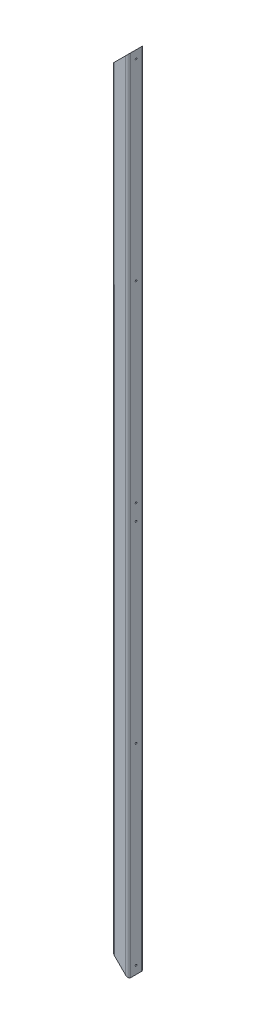
ISO-10303-21;
HEADER;
FILE_DESCRIPTION(('STEP AP214'),'2;1');
FILE_NAME('part.step','',(''),(''),'','','');
FILE_SCHEMA(('AUTOMOTIVE_DESIGN { 1 0 10303 214 1 1 1 1 }'));
ENDSEC;
DATA;
#1=APPLICATION_CONTEXT('core data for automotive mechanical design processes');
#2=APPLICATION_PROTOCOL_DEFINITION('international standard','automotive_design',2000,#1);
#3=PRODUCT_CONTEXT('',#1,'mechanical');
#4=PRODUCT('Part','Part','',(#3));
#5=PRODUCT_RELATED_PRODUCT_CATEGORY('part','',(#4));
#6=PRODUCT_DEFINITION_FORMATION('','',#4);
#7=PRODUCT_DEFINITION_CONTEXT('part definition',#1,'design');
#8=PRODUCT_DEFINITION('design','',#6,#7);
#9=PRODUCT_DEFINITION_SHAPE('','',#8);
#10=(LENGTH_UNIT() NAMED_UNIT(*) SI_UNIT(.MILLI.,.METRE.));
#11=(NAMED_UNIT(*) PLANE_ANGLE_UNIT() SI_UNIT($,.RADIAN.));
#12=(NAMED_UNIT(*) SI_UNIT($,.STERADIAN.) SOLID_ANGLE_UNIT());
#13=UNCERTAINTY_MEASURE_WITH_UNIT(LENGTH_MEASURE(1.E-05),#10,'distance_accuracy_value','');
#14=(GEOMETRIC_REPRESENTATION_CONTEXT(3) GLOBAL_UNCERTAINTY_ASSIGNED_CONTEXT((#13)) GLOBAL_UNIT_ASSIGNED_CONTEXT((#10,
#11,#12)) REPRESENTATION_CONTEXT('',''));
#15=CARTESIAN_POINT('',(0.,0.,0.));
#16=DIRECTION('',(0.,0.,1.));
#17=DIRECTION('',(1.,0.,0.));
#18=AXIS2_PLACEMENT_3D('',#15,#16,#17);
#19=CARTESIAN_POINT('',(-20.,2000.,13.6));
#20=DIRECTION('',(1.,0.,0.));
#21=DIRECTION('',(0.,0.,-1.));
#22=AXIS2_PLACEMENT_3D('',#19,#20,#21);
#23=PLANE('',#22);
#24=DIRECTION('',(0.,0.,-1.));
#25=VECTOR('',#24,1.);
#26=CARTESIAN_POINT('',(-20.,1960.,20.));
#27=LINE('',#26,#25);
#28=CARTESIAN_POINT('',(-20.,1960.,13.6));
#29=VERTEX_POINT('',#28);
#30=CARTESIAN_POINT('',(-20.,1960.,-13.6));
#31=VERTEX_POINT('',#30);
#32=EDGE_CURVE('E354',#29,#31,#27,.T.);
#33=ORIENTED_EDGE('',*,*,#32,.T.);
#34=DIRECTION('',(0.,-1.,0.));
#35=VECTOR('',#34,1.);
#36=CARTESIAN_POINT('',(-20.,2000.,-13.6));
#37=LINE('',#36,#35);
#38=CARTESIAN_POINT('',(-20.,40.,-13.6));
#39=VERTEX_POINT('',#38);
#40=EDGE_CURVE('E218',#31,#39,#37,.T.);
#41=ORIENTED_EDGE('',*,*,#40,.T.);
#42=DIRECTION('',(0.,0.,-1.));
#43=VECTOR('',#42,1.);
#44=CARTESIAN_POINT('',(-20.,40.,20.));
#45=LINE('',#44,#43);
#46=CARTESIAN_POINT('',(-20.,40.,13.6));
#47=VERTEX_POINT('',#46);
#48=EDGE_CURVE('E355',#47,#39,#45,.T.);
#49=ORIENTED_EDGE('',*,*,#48,.F.);
#50=DIRECTION('',(0.,-1.,0.));
#51=VECTOR('',#50,1.);
#52=CARTESIAN_POINT('',(-20.,2000.,13.6));
#53=LINE('',#52,#51);
#54=EDGE_CURVE('E261',#29,#47,#53,.T.);
#55=ORIENTED_EDGE('',*,*,#54,.F.);
#56=EDGE_LOOP('',(#33,#41,#49,#55));
#57=FACE_BOUND('',#56,.T.);
#58=ADVANCED_FACE('F67',(#57),#23,.F.);
#59=CARTESIAN_POINT('',(-13.6,2000.,-13.6));
#60=DIRECTION('',(0.,-1.,0.));
#61=DIRECTION('',(0.,0.,-1.));
#62=AXIS2_PLACEMENT_3D('',#59,#60,#61);
#63=CYLINDRICAL_SURFACE('',#62,6.4);
#64=CARTESIAN_POINT('',(-13.6,1966.4,-13.6));
#65=DIRECTION('',(-0.707106781186548,0.707106781186547,0.));
#66=DIRECTION('',(-0.707106781186547,-0.707106781186548,0.));
#67=AXIS2_PLACEMENT_3D('',#64,#65,#66);
#68=ELLIPSE('',#67,9.05096679918782,6.4);
#69=CARTESIAN_POINT('',(-13.6000000000001,1966.4,-20.));
#70=VERTEX_POINT('',#69);
#71=EDGE_CURVE('E290',#70,#31,#68,.T.);
#72=ORIENTED_EDGE('',*,*,#71,.F.);
#73=DIRECTION('',(0.,-1.,0.));
#74=VECTOR('',#73,1.);
#75=CARTESIAN_POINT('',(-13.6,2000.,-20.));
#76=LINE('',#75,#74);
#77=CARTESIAN_POINT('',(-13.6,33.5999999999999,-20.));
#78=VERTEX_POINT('',#77);
#79=EDGE_CURVE('E212',#70,#78,#76,.T.);
#80=ORIENTED_EDGE('',*,*,#79,.T.);
#81=CARTESIAN_POINT('',(-13.6,33.6000000000001,-13.6));
#82=DIRECTION('',(-0.707106781186547,-0.707106781186548,0.));
#83=DIRECTION('',(0.707106781186548,-0.707106781186547,0.));
#84=AXIS2_PLACEMENT_3D('',#81,#82,#83);
#85=ELLIPSE('',#84,9.05096679918781,6.4);
#86=EDGE_CURVE('E188',#39,#78,#85,.T.);
#87=ORIENTED_EDGE('',*,*,#86,.F.);
#88=ORIENTED_EDGE('',*,*,#40,.F.);
#89=EDGE_LOOP('',(#72,#80,#87,#88));
#90=FACE_BOUND('',#89,.T.);
#91=ADVANCED_FACE('F458',(#90),#63,.T.);
#92=CARTESIAN_POINT('',(13.6,2000.,-20.));
#93=DIRECTION('',(0.,0.,1.));
#94=DIRECTION('',(1.,0.,0.));
#95=AXIS2_PLACEMENT_3D('',#92,#93,#94);
#96=PLANE('',#95);
#97=DIRECTION('',(0.707106781186547,0.707106781186548,0.));
#98=VECTOR('',#97,1.);
#99=CARTESIAN_POINT('',(-990.,990.,-20.));
#100=LINE('',#99,#98);
#101=CARTESIAN_POINT('',(13.6000000000002,1993.6,-20.));
#102=VERTEX_POINT('',#101);
#103=EDGE_CURVE('E210',#70,#102,#100,.T.);
#104=ORIENTED_EDGE('',*,*,#103,.T.);
#105=DIRECTION('',(0.,-1.,0.));
#106=VECTOR('',#105,1.);
#107=CARTESIAN_POINT('',(13.6,2000.,-20.));
#108=LINE('',#107,#106);
#109=CARTESIAN_POINT('',(13.5999999999998,6.40000000000018,-20.));
#110=VERTEX_POINT('',#109);
#111=EDGE_CURVE('E202',#102,#110,#108,.T.);
#112=ORIENTED_EDGE('',*,*,#111,.T.);
#113=DIRECTION('',(-0.707106781186548,0.707106781186547,0.));
#114=VECTOR('',#113,1.);
#115=CARTESIAN_POINT('',(10.,10.,-20.));
#116=LINE('',#115,#114);
#117=EDGE_CURVE('E182',#110,#78,#116,.T.);
#118=ORIENTED_EDGE('',*,*,#117,.T.);
#119=ORIENTED_EDGE('',*,*,#79,.F.);
#120=EDGE_LOOP('',(#104,#112,#118,#119));
#121=FACE_BOUND('',#120,.T.);
#122=ADVANCED_FACE('F209',(#121),#96,.F.);
#123=CARTESIAN_POINT('',(20.,2000.,-13.6));
#124=DIRECTION('',(-1.,0.,0.));
#125=DIRECTION('',(0.,0.,1.));
#126=AXIS2_PLACEMENT_3D('',#123,#124,#125);
#127=PLANE('',#126);
#128=CARTESIAN_POINT('',(20.,1980.,0.));
#129=DIRECTION('',(1.,0.,0.));
#130=DIRECTION('',(0.,0.,-1.));
#131=AXIS2_PLACEMENT_3D('',#128,#129,#130);
#132=CIRCLE('',#131,2.);
#133=CARTESIAN_POINT('',(20.,1980.,-2.00000000000001));
#134=VERTEX_POINT('',#133);
#135=EDGE_CURVE('E394',#134,#134,#132,.T.);
#136=ORIENTED_EDGE('',*,*,#135,.F.);
#137=EDGE_LOOP('',(#136));
#138=FACE_BOUND('',#137,.T.);
#139=CARTESIAN_POINT('',(20.,500.,0.));
#140=DIRECTION('',(1.,0.,0.));
#141=DIRECTION('',(0.,0.,-1.));
#142=AXIS2_PLACEMENT_3D('',#139,#140,#141);
#143=CIRCLE('',#142,2.);
#144=CARTESIAN_POINT('',(20.,500.,-2.00000000000001));
#145=VERTEX_POINT('',#144);
#146=EDGE_CURVE('E376',#145,#145,#143,.T.);
#147=ORIENTED_EDGE('',*,*,#146,.F.);
#148=EDGE_LOOP('',(#147));
#149=FACE_BOUND('',#148,.T.);
#150=CARTESIAN_POINT('',(20.,980.,0.));
#151=DIRECTION('',(1.,0.,0.));
#152=DIRECTION('',(0.,0.,-1.));
#153=AXIS2_PLACEMENT_3D('',#150,#151,#152);
#154=CIRCLE('',#153,2.);
#155=CARTESIAN_POINT('',(20.,980.,-2.00000000000001));
#156=VERTEX_POINT('',#155);
#157=EDGE_CURVE('E402',#156,#156,#154,.T.);
#158=ORIENTED_EDGE('',*,*,#157,.F.);
#159=EDGE_LOOP('',(#158));
#160=FACE_BOUND('',#159,.T.);
#161=CARTESIAN_POINT('',(20.,1020.,0.));
#162=DIRECTION('',(1.,0.,0.));
#163=DIRECTION('',(0.,0.,-1.));
#164=AXIS2_PLACEMENT_3D('',#161,#162,#163);
#165=CIRCLE('',#164,2.);
#166=CARTESIAN_POINT('',(20.,1020.,-2.00000000000001));
#167=VERTEX_POINT('',#166);
#168=EDGE_CURVE('E377',#167,#167,#165,.T.);
#169=ORIENTED_EDGE('',*,*,#168,.F.);
#170=EDGE_LOOP('',(#169));
#171=FACE_BOUND('',#170,.T.);
#172=CARTESIAN_POINT('',(20.,20.,0.));
#173=DIRECTION('',(1.,0.,0.));
#174=DIRECTION('',(0.,0.,-1.));
#175=AXIS2_PLACEMENT_3D('',#172,#173,#174);
#176=CIRCLE('',#175,2.);
#177=CARTESIAN_POINT('',(20.,20.,-2.00000000000001));
#178=VERTEX_POINT('',#177);
#179=EDGE_CURVE('E386',#178,#178,#176,.T.);
#180=ORIENTED_EDGE('',*,*,#179,.F.);
#181=EDGE_LOOP('',(#180));
#182=FACE_BOUND('',#181,.T.);
#183=CARTESIAN_POINT('',(20.,1500.,0.));
#184=DIRECTION('',(1.,0.,0.));
#185=DIRECTION('',(0.,0.,-1.));
#186=AXIS2_PLACEMENT_3D('',#183,#184,#185);
#187=CIRCLE('',#186,2.);
#188=CARTESIAN_POINT('',(20.,1500.,-2.00000000000001));
#189=VERTEX_POINT('',#188);
#190=EDGE_CURVE('E368',#189,#189,#187,.T.);
#191=ORIENTED_EDGE('',*,*,#190,.F.);
#192=EDGE_LOOP('',(#191));
#193=FACE_BOUND('',#192,.T.);
#194=DIRECTION('',(0.,0.,-1.));
#195=VECTOR('',#194,1.);
#196=CARTESIAN_POINT('',(20.,0.,-13.6));
#197=LINE('',#196,#195);
#198=CARTESIAN_POINT('',(20.,0.,13.6));
#199=VERTEX_POINT('',#198);
#200=CARTESIAN_POINT('',(20.,0.,-13.6));
#201=VERTEX_POINT('',#200);
#202=EDGE_CURVE('E276',#199,#201,#197,.T.);
#203=ORIENTED_EDGE('',*,*,#202,.T.);
#204=DIRECTION('',(0.,-1.,0.));
#205=VECTOR('',#204,1.);
#206=CARTESIAN_POINT('',(20.,2000.,-13.6));
#207=LINE('',#206,#205);
#208=CARTESIAN_POINT('',(20.,2000.,-13.6));
#209=VERTEX_POINT('',#208);
#210=EDGE_CURVE('E204',#209,#201,#207,.T.);
#211=ORIENTED_EDGE('',*,*,#210,.F.);
#212=DIRECTION('',(0.,0.,-1.));
#213=VECTOR('',#212,1.);
#214=CARTESIAN_POINT('',(20.,2000.,-13.6));
#215=LINE('',#214,#213);
#216=CARTESIAN_POINT('',(20.,2000.,13.6));
#217=VERTEX_POINT('',#216);
#218=EDGE_CURVE('E233',#217,#209,#215,.T.);
#219=ORIENTED_EDGE('',*,*,#218,.F.);
#220=DIRECTION('',(0.,-1.,0.));
#221=VECTOR('',#220,1.);
#222=CARTESIAN_POINT('',(20.,2000.,13.6));
#223=LINE('',#222,#221);
#224=EDGE_CURVE('E216',#217,#199,#223,.T.);
#225=ORIENTED_EDGE('',*,*,#224,.T.);
#226=EDGE_LOOP('',(#203,#211,#219,#225));
#227=FACE_BOUND('',#226,.T.);
#228=ADVANCED_FACE('F425',(#138,#149,#160,#171,#182,#193,#227),#127,.F.);
#229=CARTESIAN_POINT('',(13.6,2000.,-13.6));
#230=DIRECTION('',(0.,-1.,0.));
#231=DIRECTION('',(0.,0.,-1.));
#232=AXIS2_PLACEMENT_3D('',#229,#230,#231);
#233=CYLINDRICAL_SURFACE('',#232,6.4);
#234=CARTESIAN_POINT('',(13.6,1993.6,-13.6));
#235=DIRECTION('',(-0.707106781186548,0.707106781186547,0.));
#236=DIRECTION('',(-0.707106781186547,-0.707106781186548,0.));
#237=AXIS2_PLACEMENT_3D('',#234,#235,#236);
#238=ELLIPSE('',#237,9.05096679918781,6.4);
#239=EDGE_CURVE('E287',#209,#102,#238,.T.);
#240=ORIENTED_EDGE('',*,*,#239,.F.);
#241=ORIENTED_EDGE('',*,*,#210,.T.);
#242=CARTESIAN_POINT('',(13.6,6.40000000000018,-13.6));
#243=DIRECTION('',(-0.707106781186547,-0.707106781186548,0.));
#244=DIRECTION('',(0.707106781186548,-0.707106781186547,0.));
#245=AXIS2_PLACEMENT_3D('',#242,#243,#244);
#246=ELLIPSE('',#245,9.05096679918781,6.4);
#247=EDGE_CURVE('E185',#110,#201,#246,.T.);
#248=ORIENTED_EDGE('',*,*,#247,.F.);
#249=ORIENTED_EDGE('',*,*,#111,.F.);
#250=EDGE_LOOP('',(#240,#241,#248,#249));
#251=FACE_BOUND('',#250,.T.);
#252=ADVANCED_FACE('F201',(#251),#233,.T.);
#253=CARTESIAN_POINT('',(13.6,2000.,13.6));
#254=DIRECTION('',(0.,-1.,0.));
#255=DIRECTION('',(0.,0.,-1.));
#256=AXIS2_PLACEMENT_3D('',#253,#254,#255);
#257=CYLINDRICAL_SURFACE('',#256,6.4);
#258=CARTESIAN_POINT('',(13.6,1993.6,13.6));
#259=DIRECTION('',(-0.707106781186548,0.707106781186547,0.));
#260=DIRECTION('',(-0.707106781186547,-0.707106781186548,0.));
#261=AXIS2_PLACEMENT_3D('',#258,#259,#260);
#262=ELLIPSE('',#261,9.05096679918782,6.4);
#263=CARTESIAN_POINT('',(13.6,1993.6,20.));
#264=VERTEX_POINT('',#263);
#265=EDGE_CURVE('E284',#264,#217,#262,.T.);
#266=ORIENTED_EDGE('',*,*,#265,.F.);
#267=DIRECTION('',(0.,-1.,0.));
#268=VECTOR('',#267,1.);
#269=CARTESIAN_POINT('',(13.6,2000.,20.));
#270=LINE('',#269,#268);
#271=CARTESIAN_POINT('',(13.5999999999999,6.40000000000016,20.));
#272=VERTEX_POINT('',#271);
#273=EDGE_CURVE('E77',#264,#272,#270,.T.);
#274=ORIENTED_EDGE('',*,*,#273,.T.);
#275=CARTESIAN_POINT('',(13.6,6.40000000000018,13.6));
#276=DIRECTION('',(-0.707106781186547,-0.707106781186548,0.));
#277=DIRECTION('',(0.707106781186548,-0.707106781186547,0.));
#278=AXIS2_PLACEMENT_3D('',#275,#276,#277);
#279=ELLIPSE('',#278,9.05096679918781,6.4);
#280=EDGE_CURVE('E206',#199,#272,#279,.T.);
#281=ORIENTED_EDGE('',*,*,#280,.F.);
#282=ORIENTED_EDGE('',*,*,#224,.F.);
#283=EDGE_LOOP('',(#266,#274,#281,#282));
#284=FACE_BOUND('',#283,.T.);
#285=ADVANCED_FACE('F445',(#284),#257,.T.);
#286=CARTESIAN_POINT('',(-13.6,2000.,20.));
#287=DIRECTION('',(0.,0.,-1.));
#288=DIRECTION('',(-1.,0.,0.));
#289=AXIS2_PLACEMENT_3D('',#286,#287,#288);
#290=PLANE('',#289);
#291=DIRECTION('',(0.707106781186547,0.707106781186548,0.));
#292=VECTOR('',#291,1.);
#293=CARTESIAN_POINT('',(-990.,990.,20.));
#294=LINE('',#293,#292);
#295=CARTESIAN_POINT('',(-13.5999999999999,1966.4,20.));
#296=VERTEX_POINT('',#295);
#297=EDGE_CURVE('E363',#296,#264,#294,.T.);
#298=ORIENTED_EDGE('',*,*,#297,.F.);
#299=DIRECTION('',(0.,-1.,0.));
#300=VECTOR('',#299,1.);
#301=CARTESIAN_POINT('',(-13.6,2000.,20.));
#302=LINE('',#301,#300);
#303=CARTESIAN_POINT('',(-13.5999999999998,33.5999999999999,20.));
#304=VERTEX_POINT('',#303);
#305=EDGE_CURVE('E12',#296,#304,#302,.T.);
#306=ORIENTED_EDGE('',*,*,#305,.T.);
#307=DIRECTION('',(-0.707106781186548,0.707106781186547,0.));
#308=VECTOR('',#307,1.);
#309=CARTESIAN_POINT('',(10.,10.,20.));
#310=LINE('',#309,#308);
#311=EDGE_CURVE('E194',#272,#304,#310,.T.);
#312=ORIENTED_EDGE('',*,*,#311,.F.);
#313=ORIENTED_EDGE('',*,*,#273,.F.);
#314=EDGE_LOOP('',(#298,#306,#312,#313));
#315=FACE_BOUND('',#314,.T.);
#316=ADVANCED_FACE('F449',(#315),#290,.F.);
#317=CARTESIAN_POINT('',(-13.6,2000.,13.6));
#318=DIRECTION('',(0.,-1.,0.));
#319=DIRECTION('',(0.,0.,-1.));
#320=AXIS2_PLACEMENT_3D('',#317,#318,#319);
#321=CYLINDRICAL_SURFACE('',#320,6.4);
#322=CARTESIAN_POINT('',(-13.6,1966.4,13.6));
#323=DIRECTION('',(-0.707106781186548,0.707106781186547,0.));
#324=DIRECTION('',(-0.707106781186547,-0.707106781186548,0.));
#325=AXIS2_PLACEMENT_3D('',#322,#323,#324);
#326=ELLIPSE('',#325,9.05096679918782,6.4);
#327=EDGE_CURVE('E279',#29,#296,#326,.T.);
#328=ORIENTED_EDGE('',*,*,#327,.F.);
#329=ORIENTED_EDGE('',*,*,#54,.T.);
#330=CARTESIAN_POINT('',(-13.6,33.6000000000001,13.6));
#331=DIRECTION('',(-0.707106781186547,-0.707106781186548,0.));
#332=DIRECTION('',(0.707106781186548,-0.707106781186547,0.));
#333=AXIS2_PLACEMENT_3D('',#330,#331,#332);
#334=ELLIPSE('',#333,9.05096679918781,6.4);
#335=EDGE_CURVE('E320',#304,#47,#334,.T.);
#336=ORIENTED_EDGE('',*,*,#335,.F.);
#337=ORIENTED_EDGE('',*,*,#305,.F.);
#338=EDGE_LOOP('',(#328,#329,#336,#337));
#339=FACE_BOUND('',#338,.T.);
#340=ADVANCED_FACE('F452',(#339),#321,.T.);
#341=CARTESIAN_POINT('',(10.,10.,20.));
#342=DIRECTION('',(-0.707106781186547,-0.707106781186548,0.));
#343=DIRECTION('',(0.707106781186548,-0.707106781186547,0.));
#344=AXIS2_PLACEMENT_3D('',#341,#342,#343);
#345=PLANE('',#344);
#346=DIRECTION('',(0.,0.,1.));
#347=VECTOR('',#346,1.);
#348=CARTESIAN_POINT('',(16.8,3.19999999999987,-13.6000000000005));
#349=LINE('',#348,#347);
#350=CARTESIAN_POINT('',(16.8,3.19999999999987,-13.6));
#351=VERTEX_POINT('',#350);
#352=CARTESIAN_POINT('',(16.8,3.19999999999987,13.6));
#353=VERTEX_POINT('',#352);
#354=EDGE_CURVE('E351',#351,#353,#349,.T.);
#355=ORIENTED_EDGE('',*,*,#354,.F.);
#356=CARTESIAN_POINT('',(13.6,6.40000000000018,-13.6));
#357=DIRECTION('',(-0.707106781186547,-0.707106781186548,0.));
#358=DIRECTION('',(0.707106781186548,-0.707106781186547,0.));
#359=AXIS2_PLACEMENT_3D('',#356,#357,#358);
#360=ELLIPSE('',#359,4.5254833995939,3.2);
#361=CARTESIAN_POINT('',(13.6,6.40000000000018,-16.8));
#362=VERTEX_POINT('',#361);
#363=EDGE_CURVE('E347',#362,#351,#360,.T.);
#364=ORIENTED_EDGE('',*,*,#363,.F.);
#365=DIRECTION('',(0.707106781186548,-0.707106781186547,0.));
#366=VECTOR('',#365,1.);
#367=CARTESIAN_POINT('',(-983.2,1003.2,-16.8000000000001));
#368=LINE('',#367,#366);
#369=CARTESIAN_POINT('',(-13.5999999999999,33.5999999999999,-16.8));
#370=VERTEX_POINT('',#369);
#371=EDGE_CURVE('E343',#370,#362,#368,.T.);
#372=ORIENTED_EDGE('',*,*,#371,.F.);
#373=CARTESIAN_POINT('',(-13.6,33.6000000000001,-13.6));
#374=DIRECTION('',(-0.707106781186547,-0.707106781186548,0.));
#375=DIRECTION('',(0.707106781186548,-0.707106781186547,0.));
#376=AXIS2_PLACEMENT_3D('',#373,#374,#375);
#377=ELLIPSE('',#376,4.5254833995939,3.2);
#378=CARTESIAN_POINT('',(-16.8,36.7999999999999,-13.6));
#379=VERTEX_POINT('',#378);
#380=EDGE_CURVE('E339',#379,#370,#377,.T.);
#381=ORIENTED_EDGE('',*,*,#380,.F.);
#382=DIRECTION('',(0.,0.,-1.));
#383=VECTOR('',#382,1.);
#384=CARTESIAN_POINT('',(-16.8,36.7999999999999,13.6));
#385=LINE('',#384,#383);
#386=CARTESIAN_POINT('',(-16.8,36.7999999999999,13.6));
#387=VERTEX_POINT('',#386);
#388=EDGE_CURVE('E335',#387,#379,#385,.T.);
#389=ORIENTED_EDGE('',*,*,#388,.F.);
#390=CARTESIAN_POINT('',(-13.6,33.6000000000001,13.6));
#391=DIRECTION('',(-0.707106781186547,-0.707106781186548,0.));
#392=DIRECTION('',(0.707106781186548,-0.707106781186547,0.));
#393=AXIS2_PLACEMENT_3D('',#390,#391,#392);
#394=ELLIPSE('',#393,4.5254833995939,3.2);
#395=CARTESIAN_POINT('',(-13.6,33.6000000000001,16.8));
#396=VERTEX_POINT('',#395);
#397=EDGE_CURVE('E332',#396,#387,#394,.T.);
#398=ORIENTED_EDGE('',*,*,#397,.F.);
#399=DIRECTION('',(-0.707106781186548,0.707106781186547,0.));
#400=VECTOR('',#399,1.);
#401=CARTESIAN_POINT('',(-996.8,1016.8,16.8000000000001));
#402=LINE('',#401,#400);
#403=CARTESIAN_POINT('',(13.5999999999998,6.40000000000018,16.8));
#404=VERTEX_POINT('',#403);
#405=EDGE_CURVE('E329',#404,#396,#402,.T.);
#406=ORIENTED_EDGE('',*,*,#405,.F.);
#407=CARTESIAN_POINT('',(13.6,6.40000000000018,13.6));
#408=DIRECTION('',(-0.707106781186547,-0.707106781186548,0.));
#409=DIRECTION('',(0.707106781186548,-0.707106781186547,0.));
#410=AXIS2_PLACEMENT_3D('',#407,#408,#409);
#411=ELLIPSE('',#410,4.52548339959391,3.2);
#412=EDGE_CURVE('E93',#353,#404,#411,.T.);
#413=ORIENTED_EDGE('',*,*,#412,.F.);
#414=EDGE_LOOP('',(#355,#364,#372,#381,#389,#398,#406,#413));
#415=FACE_BOUND('',#414,.T.);
#416=ORIENTED_EDGE('',*,*,#335,.T.);
#417=ORIENTED_EDGE('',*,*,#48,.T.);
#418=ORIENTED_EDGE('',*,*,#86,.T.);
#419=ORIENTED_EDGE('',*,*,#117,.F.);
#420=ORIENTED_EDGE('',*,*,#247,.T.);
#421=ORIENTED_EDGE('',*,*,#202,.F.);
#422=ORIENTED_EDGE('',*,*,#280,.T.);
#423=ORIENTED_EDGE('',*,*,#311,.T.);
#424=EDGE_LOOP('',(#416,#417,#418,#419,#420,#421,#422,#423));
#425=FACE_BOUND('',#424,.T.);
#426=ADVANCED_FACE('F184',(#415,#425),#345,.T.);
#427=CARTESIAN_POINT('',(-990.,990.,20.));
#428=DIRECTION('',(-0.707106781186548,0.707106781186547,0.));
#429=DIRECTION('',(-0.707106781186547,-0.707106781186548,0.));
#430=AXIS2_PLACEMENT_3D('',#427,#428,#429);
#431=PLANE('',#430);
#432=DIRECTION('',(0.707106781186547,0.707106781186548,0.));
#433=VECTOR('',#432,1.);
#434=CARTESIAN_POINT('',(3.19999999999985,1983.2,16.8));
#435=LINE('',#434,#433);
#436=CARTESIAN_POINT('',(-13.6,1966.4,16.8));
#437=VERTEX_POINT('',#436);
#438=CARTESIAN_POINT('',(13.6,1993.6,16.8));
#439=VERTEX_POINT('',#438);
#440=EDGE_CURVE('E297',#437,#439,#435,.T.);
#441=ORIENTED_EDGE('',*,*,#440,.F.);
#442=CARTESIAN_POINT('',(-13.6,1966.4,13.6));
#443=DIRECTION('',(-0.707106781186548,0.707106781186547,0.));
#444=DIRECTION('',(-0.707106781186547,-0.707106781186548,0.));
#445=AXIS2_PLACEMENT_3D('',#442,#443,#444);
#446=ELLIPSE('',#445,4.5254833995939,3.2);
#447=CARTESIAN_POINT('',(-16.8,1963.2,13.6));
#448=VERTEX_POINT('',#447);
#449=EDGE_CURVE('E300',#448,#437,#446,.T.);
#450=ORIENTED_EDGE('',*,*,#449,.F.);
#451=DIRECTION('',(0.,0.,1.));
#452=VECTOR('',#451,1.);
#453=CARTESIAN_POINT('',(-16.8,1963.2,13.6));
#454=LINE('',#453,#452);
#455=CARTESIAN_POINT('',(-16.8,1963.2,-13.6));
#456=VERTEX_POINT('',#455);
#457=EDGE_CURVE('E303',#456,#448,#454,.T.);
#458=ORIENTED_EDGE('',*,*,#457,.F.);
#459=CARTESIAN_POINT('',(-13.6,1966.4,-13.6));
#460=DIRECTION('',(-0.707106781186548,0.707106781186547,0.));
#461=DIRECTION('',(-0.707106781186547,-0.707106781186548,0.));
#462=AXIS2_PLACEMENT_3D('',#459,#460,#461);
#463=ELLIPSE('',#462,4.5254833995939,3.2);
#464=CARTESIAN_POINT('',(-13.6,1966.4,-16.8));
#465=VERTEX_POINT('',#464);
#466=EDGE_CURVE('E307',#465,#456,#463,.T.);
#467=ORIENTED_EDGE('',*,*,#466,.F.);
#468=DIRECTION('',(-0.707106781186547,-0.707106781186548,0.));
#469=VECTOR('',#468,1.);
#470=CARTESIAN_POINT('',(16.7999999999999,1996.8,-16.8));
#471=LINE('',#470,#469);
#472=CARTESIAN_POINT('',(13.6,1993.6,-16.8));
#473=VERTEX_POINT('',#472);
#474=EDGE_CURVE('E311',#473,#465,#471,.T.);
#475=ORIENTED_EDGE('',*,*,#474,.F.);
#476=CARTESIAN_POINT('',(13.6,1993.6,-13.6));
#477=DIRECTION('',(-0.707106781186548,0.707106781186547,0.));
#478=DIRECTION('',(-0.707106781186547,-0.707106781186548,0.));
#479=AXIS2_PLACEMENT_3D('',#476,#477,#478);
#480=ELLIPSE('',#479,4.5254833995939,3.2);
#481=CARTESIAN_POINT('',(16.8,1996.8,-13.6));
#482=VERTEX_POINT('',#481);
#483=EDGE_CURVE('E85',#482,#473,#480,.T.);
#484=ORIENTED_EDGE('',*,*,#483,.F.);
#485=DIRECTION('',(0.,0.,-1.));
#486=VECTOR('',#485,1.);
#487=CARTESIAN_POINT('',(16.8,1996.8,-13.6));
#488=LINE('',#487,#486);
#489=CARTESIAN_POINT('',(16.8,1996.8,13.6));
#490=VERTEX_POINT('',#489);
#491=EDGE_CURVE('E317',#490,#482,#488,.T.);
#492=ORIENTED_EDGE('',*,*,#491,.F.);
#493=CARTESIAN_POINT('',(13.6,1993.6,13.6));
#494=DIRECTION('',(-0.707106781186548,0.707106781186547,0.));
#495=DIRECTION('',(-0.707106781186547,-0.707106781186548,0.));
#496=AXIS2_PLACEMENT_3D('',#493,#494,#495);
#497=ELLIPSE('',#496,4.52548339959391,3.2);
#498=EDGE_CURVE('E293',#439,#490,#497,.T.);
#499=ORIENTED_EDGE('',*,*,#498,.F.);
#500=EDGE_LOOP('',(#441,#450,#458,#467,#475,#484,#492,#499));
#501=FACE_BOUND('',#500,.T.);
#502=ORIENTED_EDGE('',*,*,#327,.T.);
#503=ORIENTED_EDGE('',*,*,#297,.T.);
#504=ORIENTED_EDGE('',*,*,#265,.T.);
#505=ORIENTED_EDGE('',*,*,#218,.T.);
#506=ORIENTED_EDGE('',*,*,#239,.T.);
#507=ORIENTED_EDGE('',*,*,#103,.F.);
#508=ORIENTED_EDGE('',*,*,#71,.T.);
#509=ORIENTED_EDGE('',*,*,#32,.F.);
#510=EDGE_LOOP('',(#502,#503,#504,#505,#506,#507,#508,#509));
#511=FACE_BOUND('',#510,.T.);
#512=ADVANCED_FACE('F459',(#501,#511),#431,.T.);
#513=CARTESIAN_POINT('',(13.6,2000.,13.6));
#514=DIRECTION('',(0.,-1.,0.));
#515=DIRECTION('',(0.,0.,-1.));
#516=AXIS2_PLACEMENT_3D('',#513,#514,#515);
#517=CYLINDRICAL_SURFACE('',#516,3.2);
#518=DIRECTION('',(0.,-1.,0.));
#519=VECTOR('',#518,1.);
#520=CARTESIAN_POINT('',(13.6,2000.,16.8));
#521=LINE('',#520,#519);
#522=EDGE_CURVE('E71',#439,#404,#521,.T.);
#523=ORIENTED_EDGE('',*,*,#522,.F.);
#524=ORIENTED_EDGE('',*,*,#498,.T.);
#525=DIRECTION('',(0.,-1.,0.));
#526=VECTOR('',#525,1.);
#527=CARTESIAN_POINT('',(16.8,2000.,13.6));
#528=LINE('',#527,#526);
#529=EDGE_CURVE('E228',#490,#353,#528,.T.);
#530=ORIENTED_EDGE('',*,*,#529,.T.);
#531=ORIENTED_EDGE('',*,*,#412,.T.);
#532=EDGE_LOOP('',(#523,#524,#530,#531));
#533=FACE_BOUND('',#532,.T.);
#534=ADVANCED_FACE('F69',(#533),#517,.F.);
#535=CARTESIAN_POINT('',(-13.6,2000.,16.8));
#536=DIRECTION('',(0.,0.,-1.));
#537=DIRECTION('',(-1.,0.,0.));
#538=AXIS2_PLACEMENT_3D('',#535,#536,#537);
#539=PLANE('',#538);
#540=DIRECTION('',(0.,-1.,0.));
#541=VECTOR('',#540,1.);
#542=CARTESIAN_POINT('',(-13.6,2000.,16.8));
#543=LINE('',#542,#541);
#544=EDGE_CURVE('E252',#437,#396,#543,.T.);
#545=ORIENTED_EDGE('',*,*,#544,.F.);
#546=ORIENTED_EDGE('',*,*,#440,.T.);
#547=ORIENTED_EDGE('',*,*,#522,.T.);
#548=ORIENTED_EDGE('',*,*,#405,.T.);
#549=EDGE_LOOP('',(#545,#546,#547,#548));
#550=FACE_BOUND('',#549,.T.);
#551=ADVANCED_FACE('F466',(#550),#539,.T.);
#552=CARTESIAN_POINT('',(-13.6,2000.,13.6));
#553=DIRECTION('',(0.,-1.,0.));
#554=DIRECTION('',(0.,0.,-1.));
#555=AXIS2_PLACEMENT_3D('',#552,#553,#554);
#556=CYLINDRICAL_SURFACE('',#555,3.2);
#557=DIRECTION('',(0.,-1.,0.));
#558=VECTOR('',#557,1.);
#559=CARTESIAN_POINT('',(-16.8,2000.,13.6));
#560=LINE('',#559,#558);
#561=EDGE_CURVE('E249',#448,#387,#560,.T.);
#562=ORIENTED_EDGE('',*,*,#561,.F.);
#563=ORIENTED_EDGE('',*,*,#449,.T.);
#564=ORIENTED_EDGE('',*,*,#544,.T.);
#565=ORIENTED_EDGE('',*,*,#397,.T.);
#566=EDGE_LOOP('',(#562,#563,#564,#565));
#567=FACE_BOUND('',#566,.T.);
#568=ADVANCED_FACE('F507',(#567),#556,.F.);
#569=CARTESIAN_POINT('',(-16.8,2000.,13.6));
#570=DIRECTION('',(1.,0.,0.));
#571=DIRECTION('',(0.,0.,-1.));
#572=AXIS2_PLACEMENT_3D('',#569,#570,#571);
#573=PLANE('',#572);
#574=DIRECTION('',(0.,-1.,0.));
#575=VECTOR('',#574,1.);
#576=CARTESIAN_POINT('',(-16.8,2000.,-13.6));
#577=LINE('',#576,#575);
#578=EDGE_CURVE('E245',#456,#379,#577,.T.);
#579=ORIENTED_EDGE('',*,*,#578,.F.);
#580=ORIENTED_EDGE('',*,*,#457,.T.);
#581=ORIENTED_EDGE('',*,*,#561,.T.);
#582=ORIENTED_EDGE('',*,*,#388,.T.);
#583=EDGE_LOOP('',(#579,#580,#581,#582));
#584=FACE_BOUND('',#583,.T.);
#585=ADVANCED_FACE('F503',(#584),#573,.T.);
#586=CARTESIAN_POINT('',(-13.6,2000.,-13.6));
#587=DIRECTION('',(0.,-1.,0.));
#588=DIRECTION('',(0.,0.,-1.));
#589=AXIS2_PLACEMENT_3D('',#586,#587,#588);
#590=CYLINDRICAL_SURFACE('',#589,3.2);
#591=DIRECTION('',(0.,-1.,0.));
#592=VECTOR('',#591,1.);
#593=CARTESIAN_POINT('',(-13.6,2000.,-16.8));
#594=LINE('',#593,#592);
#595=EDGE_CURVE('E241',#465,#370,#594,.T.);
#596=ORIENTED_EDGE('',*,*,#595,.F.);
#597=ORIENTED_EDGE('',*,*,#466,.T.);
#598=ORIENTED_EDGE('',*,*,#578,.T.);
#599=ORIENTED_EDGE('',*,*,#380,.T.);
#600=EDGE_LOOP('',(#596,#597,#598,#599));
#601=FACE_BOUND('',#600,.T.);
#602=ADVANCED_FACE('F499',(#601),#590,.F.);
#603=CARTESIAN_POINT('',(13.6,2000.,-16.8));
#604=DIRECTION('',(0.,0.,1.));
#605=DIRECTION('',(1.,0.,0.));
#606=AXIS2_PLACEMENT_3D('',#603,#604,#605);
#607=PLANE('',#606);
#608=DIRECTION('',(0.,-1.,0.));
#609=VECTOR('',#608,1.);
#610=CARTESIAN_POINT('',(13.6,2000.,-16.8));
#611=LINE('',#610,#609);
#612=EDGE_CURVE('E237',#473,#362,#611,.T.);
#613=ORIENTED_EDGE('',*,*,#612,.F.);
#614=ORIENTED_EDGE('',*,*,#474,.T.);
#615=ORIENTED_EDGE('',*,*,#595,.T.);
#616=ORIENTED_EDGE('',*,*,#371,.T.);
#617=EDGE_LOOP('',(#613,#614,#615,#616));
#618=FACE_BOUND('',#617,.T.);
#619=ADVANCED_FACE('F495',(#618),#607,.T.);
#620=CARTESIAN_POINT('',(13.6,2000.,-13.6));
#621=DIRECTION('',(0.,-1.,0.));
#622=DIRECTION('',(0.,0.,-1.));
#623=AXIS2_PLACEMENT_3D('',#620,#621,#622);
#624=CYLINDRICAL_SURFACE('',#623,3.2);
#625=DIRECTION('',(0.,-1.,0.));
#626=VECTOR('',#625,1.);
#627=CARTESIAN_POINT('',(16.8,2000.,-13.6));
#628=LINE('',#627,#626);
#629=EDGE_CURVE('E232',#482,#351,#628,.T.);
#630=ORIENTED_EDGE('',*,*,#629,.F.);
#631=ORIENTED_EDGE('',*,*,#483,.T.);
#632=ORIENTED_EDGE('',*,*,#612,.T.);
#633=ORIENTED_EDGE('',*,*,#363,.T.);
#634=EDGE_LOOP('',(#630,#631,#632,#633));
#635=FACE_BOUND('',#634,.T.);
#636=ADVANCED_FACE('F491',(#635),#624,.F.);
#637=CARTESIAN_POINT('',(16.8,2000.,-13.6));
#638=DIRECTION('',(-1.,0.,0.));
#639=DIRECTION('',(0.,0.,1.));
#640=AXIS2_PLACEMENT_3D('',#637,#638,#639);
#641=PLANE('',#640);
#642=ORIENTED_EDGE('',*,*,#529,.F.);
#643=ORIENTED_EDGE('',*,*,#491,.T.);
#644=ORIENTED_EDGE('',*,*,#629,.T.);
#645=ORIENTED_EDGE('',*,*,#354,.T.);
#646=EDGE_LOOP('',(#642,#643,#644,#645));
#647=FACE_BOUND('',#646,.T.);
#648=ADVANCED_FACE('F487',(#647),#641,.T.);
#649=CARTESIAN_POINT('',(17.,1500.,0.));
#650=DIRECTION('',(1.,0.,0.));
#651=DIRECTION('',(0.,0.,-1.));
#652=AXIS2_PLACEMENT_3D('',#649,#650,#651);
#653=CYLINDRICAL_SURFACE('',#652,2.);
#654=CARTESIAN_POINT('',(17.,1500.,0.));
#655=DIRECTION('',(1.,0.,0.));
#656=DIRECTION('',(0.,0.,-1.));
#657=AXIS2_PLACEMENT_3D('',#654,#655,#656);
#658=CIRCLE('',#657,2.);
#659=CARTESIAN_POINT('',(17.,1500.,-2.00000000000001));
#660=VERTEX_POINT('',#659);
#661=EDGE_CURVE('E372',#660,#660,#658,.T.);
#662=ORIENTED_EDGE('',*,*,#661,.F.);
#663=EDGE_LOOP('',(#662));
#664=FACE_BOUND('',#663,.T.);
#665=ORIENTED_EDGE('',*,*,#190,.T.);
#666=EDGE_LOOP('',(#665));
#667=FACE_BOUND('',#666,.T.);
#668=ADVANCED_FACE('F490',(#664,#667),#653,.F.);
#669=CARTESIAN_POINT('',(17.,1500.,0.));
#670=DIRECTION('',(1.,0.,0.));
#671=DIRECTION('',(0.,0.,-1.));
#672=AXIS2_PLACEMENT_3D('',#669,#670,#671);
#673=PLANE('',#672);
#674=ORIENTED_EDGE('',*,*,#661,.T.);
#675=EDGE_LOOP('',(#674));
#676=FACE_BOUND('',#675,.T.);
#677=ADVANCED_FACE('F552',(#676),#673,.T.);
#678=CARTESIAN_POINT('',(17.,20.,0.));
#679=DIRECTION('',(1.,0.,0.));
#680=DIRECTION('',(0.,0.,-1.));
#681=AXIS2_PLACEMENT_3D('',#678,#679,#680);
#682=CYLINDRICAL_SURFACE('',#681,2.);
#683=CARTESIAN_POINT('',(17.,20.,0.));
#684=DIRECTION('',(1.,0.,0.));
#685=DIRECTION('',(0.,0.,-1.));
#686=AXIS2_PLACEMENT_3D('',#683,#684,#685);
#687=CIRCLE('',#686,2.);
#688=CARTESIAN_POINT('',(17.,20.,-2.));
#689=VERTEX_POINT('',#688);
#690=EDGE_CURVE('E390',#689,#689,#687,.T.);
#691=ORIENTED_EDGE('',*,*,#690,.F.);
#692=EDGE_LOOP('',(#691));
#693=FACE_BOUND('',#692,.T.);
#694=ORIENTED_EDGE('',*,*,#179,.T.);
#695=EDGE_LOOP('',(#694));
#696=FACE_BOUND('',#695,.T.);
#697=ADVANCED_FACE('F559',(#693,#696),#682,.F.);
#698=CARTESIAN_POINT('',(17.,20.,0.));
#699=DIRECTION('',(1.,0.,0.));
#700=DIRECTION('',(0.,0.,-1.));
#701=AXIS2_PLACEMENT_3D('',#698,#699,#700);
#702=PLANE('',#701);
#703=ORIENTED_EDGE('',*,*,#690,.T.);
#704=EDGE_LOOP('',(#703));
#705=FACE_BOUND('',#704,.T.);
#706=ADVANCED_FACE('F567',(#705),#702,.T.);
#707=CARTESIAN_POINT('',(17.,1020.,0.));
#708=DIRECTION('',(1.,0.,0.));
#709=DIRECTION('',(0.,0.,-1.));
#710=AXIS2_PLACEMENT_3D('',#707,#708,#709);
#711=CYLINDRICAL_SURFACE('',#710,2.);
#712=CARTESIAN_POINT('',(17.,1020.,0.));
#713=DIRECTION('',(1.,0.,0.));
#714=DIRECTION('',(0.,0.,-1.));
#715=AXIS2_PLACEMENT_3D('',#712,#713,#714);
#716=CIRCLE('',#715,2.);
#717=CARTESIAN_POINT('',(17.,1020.,-2.00000000000001));
#718=VERTEX_POINT('',#717);
#719=EDGE_CURVE('E381',#718,#718,#716,.T.);
#720=ORIENTED_EDGE('',*,*,#719,.F.);
#721=EDGE_LOOP('',(#720));
#722=FACE_BOUND('',#721,.T.);
#723=ORIENTED_EDGE('',*,*,#168,.T.);
#724=EDGE_LOOP('',(#723));
#725=FACE_BOUND('',#724,.T.);
#726=ADVANCED_FACE('F575',(#722,#725),#711,.F.);
#727=CARTESIAN_POINT('',(17.,1020.,0.));
#728=DIRECTION('',(1.,0.,0.));
#729=DIRECTION('',(0.,0.,-1.));
#730=AXIS2_PLACEMENT_3D('',#727,#728,#729);
#731=PLANE('',#730);
#732=ORIENTED_EDGE('',*,*,#719,.T.);
#733=EDGE_LOOP('',(#732));
#734=FACE_BOUND('',#733,.T.);
#735=ADVANCED_FACE('F583',(#734),#731,.T.);
#736=CARTESIAN_POINT('',(17.,980.,0.));
#737=DIRECTION('',(1.,0.,0.));
#738=DIRECTION('',(0.,0.,-1.));
#739=AXIS2_PLACEMENT_3D('',#736,#737,#738);
#740=CYLINDRICAL_SURFACE('',#739,2.);
#741=CARTESIAN_POINT('',(17.,980.,0.));
#742=DIRECTION('',(1.,0.,0.));
#743=DIRECTION('',(0.,0.,-1.));
#744=AXIS2_PLACEMENT_3D('',#741,#742,#743);
#745=CIRCLE('',#744,2.);
#746=CARTESIAN_POINT('',(17.,980.,-2.00000000000001));
#747=VERTEX_POINT('',#746);
#748=EDGE_CURVE('E382',#747,#747,#745,.T.);
#749=ORIENTED_EDGE('',*,*,#748,.F.);
#750=EDGE_LOOP('',(#749));
#751=FACE_BOUND('',#750,.T.);
#752=ORIENTED_EDGE('',*,*,#157,.T.);
#753=EDGE_LOOP('',(#752));
#754=FACE_BOUND('',#753,.T.);
#755=ADVANCED_FACE('F591',(#751,#754),#740,.F.);
#756=CARTESIAN_POINT('',(17.,980.,0.));
#757=DIRECTION('',(1.,0.,0.));
#758=DIRECTION('',(0.,0.,-1.));
#759=AXIS2_PLACEMENT_3D('',#756,#757,#758);
#760=PLANE('',#759);
#761=ORIENTED_EDGE('',*,*,#748,.T.);
#762=EDGE_LOOP('',(#761));
#763=FACE_BOUND('',#762,.T.);
#764=ADVANCED_FACE('F599',(#763),#760,.T.);
#765=CARTESIAN_POINT('',(17.,500.,0.));
#766=DIRECTION('',(1.,0.,0.));
#767=DIRECTION('',(0.,0.,-1.));
#768=AXIS2_PLACEMENT_3D('',#765,#766,#767);
#769=CYLINDRICAL_SURFACE('',#768,2.);
#770=CARTESIAN_POINT('',(17.,500.,0.));
#771=DIRECTION('',(1.,0.,0.));
#772=DIRECTION('',(0.,0.,-1.));
#773=AXIS2_PLACEMENT_3D('',#770,#771,#772);
#774=CIRCLE('',#773,2.);
#775=CARTESIAN_POINT('',(17.,500.,-2.00000000000001));
#776=VERTEX_POINT('',#775);
#777=EDGE_CURVE('E398',#776,#776,#774,.T.);
#778=ORIENTED_EDGE('',*,*,#777,.F.);
#779=EDGE_LOOP('',(#778));
#780=FACE_BOUND('',#779,.T.);
#781=ORIENTED_EDGE('',*,*,#146,.T.);
#782=EDGE_LOOP('',(#781));
#783=FACE_BOUND('',#782,.T.);
#784=ADVANCED_FACE('F607',(#780,#783),#769,.F.);
#785=CARTESIAN_POINT('',(17.,500.,0.));
#786=DIRECTION('',(1.,0.,0.));
#787=DIRECTION('',(0.,0.,-1.));
#788=AXIS2_PLACEMENT_3D('',#785,#786,#787);
#789=PLANE('',#788);
#790=ORIENTED_EDGE('',*,*,#777,.T.);
#791=EDGE_LOOP('',(#790));
#792=FACE_BOUND('',#791,.T.);
#793=ADVANCED_FACE('F421',(#792),#789,.T.);
#794=CARTESIAN_POINT('',(17.,1980.,0.));
#795=DIRECTION('',(1.,0.,0.));
#796=DIRECTION('',(0.,0.,-1.));
#797=AXIS2_PLACEMENT_3D('',#794,#795,#796);
#798=CYLINDRICAL_SURFACE('',#797,2.);
#799=CARTESIAN_POINT('',(17.,1980.,0.));
#800=DIRECTION('',(1.,0.,0.));
#801=DIRECTION('',(0.,0.,-1.));
#802=AXIS2_PLACEMENT_3D('',#799,#800,#801);
#803=CIRCLE('',#802,2.);
#804=CARTESIAN_POINT('',(17.,1980.,-2.00000000000001));
#805=VERTEX_POINT('',#804);
#806=EDGE_CURVE('E195',#805,#805,#803,.T.);
#807=ORIENTED_EDGE('',*,*,#806,.F.);
#808=EDGE_LOOP('',(#807));
#809=FACE_BOUND('',#808,.T.);
#810=ORIENTED_EDGE('',*,*,#135,.T.);
#811=EDGE_LOOP('',(#810));
#812=FACE_BOUND('',#811,.T.);
#813=ADVANCED_FACE('F418',(#809,#812),#798,.F.);
#814=CARTESIAN_POINT('',(17.,1980.,0.));
#815=DIRECTION('',(1.,0.,0.));
#816=DIRECTION('',(0.,0.,-1.));
#817=AXIS2_PLACEMENT_3D('',#814,#815,#816);
#818=PLANE('',#817);
#819=ORIENTED_EDGE('',*,*,#806,.T.);
#820=EDGE_LOOP('',(#819));
#821=FACE_BOUND('',#820,.T.);
#822=ADVANCED_FACE('F416',(#821),#818,.T.);
#823=CLOSED_SHELL('',(#58,#91,#122,#228,#252,#285,#316,#340,#426,#512,#534,#551,#568,#585,#602,
#619,#636,#648,#668,#677,#697,#706,#726,#735,#755,#764,#784,#793,#813,#822));
#824=MANIFOLD_SOLID_BREP('B2',#823);
#825=ADVANCED_BREP_SHAPE_REPRESENTATION('',(#18,#824),#14);
#826=SHAPE_DEFINITION_REPRESENTATION(#9,#825);
ENDSEC;
END-ISO-10303-21;
